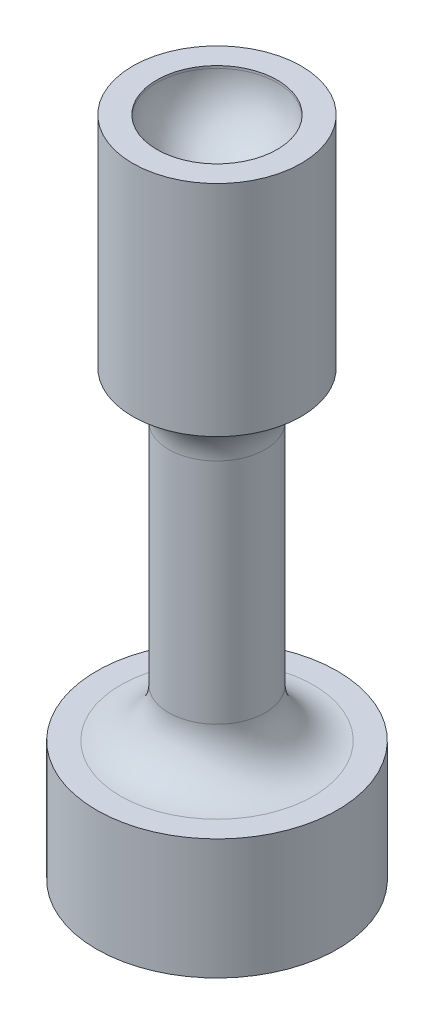
ISO-10303-21;
HEADER;
FILE_DESCRIPTION(('STEP AP214'),'2;1');
FILE_NAME('part.step','',(''),(''),'','','');
FILE_SCHEMA(('AUTOMOTIVE_DESIGN { 1 0 10303 214 1 1 1 1 }'));
ENDSEC;
DATA;
#1=APPLICATION_CONTEXT('core data for automotive mechanical design processes');
#2=APPLICATION_PROTOCOL_DEFINITION('international standard','automotive_design',2000,#1);
#3=PRODUCT_CONTEXT('',#1,'mechanical');
#4=PRODUCT('Part','Part','',(#3));
#5=PRODUCT_RELATED_PRODUCT_CATEGORY('part','',(#4));
#6=PRODUCT_DEFINITION_FORMATION('','',#4);
#7=PRODUCT_DEFINITION_CONTEXT('part definition',#1,'design');
#8=PRODUCT_DEFINITION('design','',#6,#7);
#9=PRODUCT_DEFINITION_SHAPE('','',#8);
#10=(LENGTH_UNIT() NAMED_UNIT(*) SI_UNIT(.MILLI.,.METRE.));
#11=(NAMED_UNIT(*) PLANE_ANGLE_UNIT() SI_UNIT($,.RADIAN.));
#12=(NAMED_UNIT(*) SI_UNIT($,.STERADIAN.) SOLID_ANGLE_UNIT());
#13=UNCERTAINTY_MEASURE_WITH_UNIT(LENGTH_MEASURE(1.E-05),#10,'distance_accuracy_value','');
#14=(GEOMETRIC_REPRESENTATION_CONTEXT(3) GLOBAL_UNCERTAINTY_ASSIGNED_CONTEXT((#13)) GLOBAL_UNIT_ASSIGNED_CONTEXT((#10,
#11,#12)) REPRESENTATION_CONTEXT('',''));
#15=CARTESIAN_POINT('',(0.,0.,0.));
#16=DIRECTION('',(0.,0.,1.));
#17=DIRECTION('',(1.,0.,0.));
#18=AXIS2_PLACEMENT_3D('',#15,#16,#17);
#19=CARTESIAN_POINT('',(0.,5.,0.));
#20=DIRECTION('',(0.,1.,0.));
#21=DIRECTION('',(0.,0.,1.));
#22=AXIS2_PLACEMENT_3D('',#19,#20,#21);
#23=PLANE('',#22);
#24=CARTESIAN_POINT('',(0.,5.,0.));
#25=DIRECTION('',(0.,1.,0.));
#26=DIRECTION('',(0.,0.,1.));
#27=AXIS2_PLACEMENT_3D('',#24,#25,#26);
#28=CIRCLE('',#27,4.);
#29=CARTESIAN_POINT('',(0.,5.,4.));
#30=VERTEX_POINT('',#29);
#31=EDGE_CURVE('E158',#30,#30,#28,.F.);
#32=ORIENTED_EDGE('',*,*,#31,.T.);
#33=EDGE_LOOP('',(#32));
#34=FACE_BOUND('',#33,.T.);
#35=CARTESIAN_POINT('',(0.,5.,0.));
#36=DIRECTION('',(0.,1.,0.));
#37=DIRECTION('',(0.,0.,1.));
#38=AXIS2_PLACEMENT_3D('',#35,#36,#37);
#39=CIRCLE('',#38,5.);
#40=CARTESIAN_POINT('',(0.,5.,5.));
#41=VERTEX_POINT('',#40);
#42=EDGE_CURVE('E148',#41,#41,#39,.T.);
#43=ORIENTED_EDGE('',*,*,#42,.T.);
#44=EDGE_LOOP('',(#43));
#45=FACE_BOUND('',#44,.T.);
#46=ADVANCED_FACE('F37',(#34,#45),#23,.T.);
#47=CARTESIAN_POINT('',(0.,0.,0.));
#48=DIRECTION('',(0.,1.,0.));
#49=DIRECTION('',(0.,0.,1.));
#50=AXIS2_PLACEMENT_3D('',#47,#48,#49);
#51=PLANE('',#50);
#52=DIRECTION('',(-0.491655792264215,0.,-0.870789631273276));
#53=VECTOR('',#52,1.);
#54=CARTESIAN_POINT('',(-2.05426209541312,0.,3.48042247100582));
#55=LINE('',#54,#53);
#56=CARTESIAN_POINT('',(-2.05426209541312,0.,3.48042247100582));
#57=VERTEX_POINT('',#56);
#58=CARTESIAN_POINT('',(-4.04126532349981,0.,-0.0388319251563097));
#59=VERTEX_POINT('',#58);
#60=EDGE_CURVE('E126',#57,#59,#55,.T.);
#61=ORIENTED_EDGE('',*,*,#60,.F.);
#62=DIRECTION('',(-0.999953838166848,0.,-0.00960840961806301));
#63=VECTOR('',#62,1.);
#64=CARTESIAN_POINT('',(1.98700322808668,0.,3.51925439616213));
#65=LINE('',#64,#63);
#66=CARTESIAN_POINT('',(1.98700322808668,0.,3.51925439616213));
#67=VERTEX_POINT('',#66);
#68=EDGE_CURVE('E52',#67,#57,#65,.T.);
#69=ORIENTED_EDGE('',*,*,#68,.F.);
#70=DIRECTION('',(-0.508298045902633,0.,0.861181221655212));
#71=VECTOR('',#70,1.);
#72=CARTESIAN_POINT('',(4.04126532349981,0.,0.0388319251563125));
#73=LINE('',#72,#71);
#74=CARTESIAN_POINT('',(4.04126532349981,0.,0.0388319251563125));
#75=VERTEX_POINT('',#74);
#76=EDGE_CURVE('E136',#75,#67,#73,.T.);
#77=ORIENTED_EDGE('',*,*,#76,.F.);
#78=DIRECTION('',(0.491655792264215,0.,0.870789631273276));
#79=VECTOR('',#78,1.);
#80=CARTESIAN_POINT('',(2.05426209541312,0.,-3.48042247100581));
#81=LINE('',#80,#79);
#82=CARTESIAN_POINT('',(2.05426209541312,0.,-3.48042247100581));
#83=VERTEX_POINT('',#82);
#84=EDGE_CURVE('E134',#83,#75,#81,.T.);
#85=ORIENTED_EDGE('',*,*,#84,.F.);
#86=DIRECTION('',(0.999953838166848,0.,0.00960840961806322));
#87=VECTOR('',#86,1.);
#88=CARTESIAN_POINT('',(-1.98700322808668,0.,-3.51925439616212));
#89=LINE('',#88,#87);
#90=CARTESIAN_POINT('',(-1.98700322808668,0.,-3.51925439616212));
#91=VERTEX_POINT('',#90);
#92=EDGE_CURVE('E100',#91,#83,#89,.T.);
#93=ORIENTED_EDGE('',*,*,#92,.F.);
#94=DIRECTION('',(0.508298045902633,0.,-0.861181221655212));
#95=VECTOR('',#94,1.);
#96=CARTESIAN_POINT('',(-4.04126532349981,0.,-0.0388319251563097));
#97=LINE('',#96,#95);
#98=EDGE_CURVE('E130',#59,#91,#97,.T.);
#99=ORIENTED_EDGE('',*,*,#98,.F.);
#100=EDGE_LOOP('',(#61,#69,#77,#85,#93,#99));
#101=FACE_BOUND('',#100,.T.);
#102=CARTESIAN_POINT('',(0.,0.,0.));
#103=DIRECTION('',(0.,1.,0.));
#104=DIRECTION('',(0.,0.,1.));
#105=AXIS2_PLACEMENT_3D('',#102,#103,#104);
#106=CIRCLE('',#105,5.);
#107=CARTESIAN_POINT('',(0.,0.,5.));
#108=VERTEX_POINT('',#107);
#109=EDGE_CURVE('E155',#108,#108,#106,.T.);
#110=ORIENTED_EDGE('',*,*,#109,.F.);
#111=EDGE_LOOP('',(#110));
#112=FACE_BOUND('',#111,.T.);
#113=ADVANCED_FACE('F177',(#101,#112),#51,.F.);
#114=CARTESIAN_POINT('',(0.,27.5,0.));
#115=DIRECTION('',(0.,-1.,0.));
#116=DIRECTION('',(0.,0.,-1.));
#117=AXIS2_PLACEMENT_3D('',#114,#115,#116);
#118=CYLINDRICAL_SURFACE('',#117,5.);
#119=ORIENTED_EDGE('',*,*,#109,.T.);
#120=EDGE_LOOP('',(#119));
#121=FACE_BOUND('',#120,.T.);
#122=ORIENTED_EDGE('',*,*,#42,.F.);
#123=EDGE_LOOP('',(#122));
#124=FACE_BOUND('',#123,.T.);
#125=ADVANCED_FACE('F181',(#121,#124),#118,.T.);
#126=CARTESIAN_POINT('',(1.98700322808668,3.,3.51925439616213));
#127=DIRECTION('',(-0.00960840961806301,0.,0.999953838166848));
#128=DIRECTION('',(0.999953838166848,0.,0.00960840961806301));
#129=AXIS2_PLACEMENT_3D('',#126,#127,#128);
#130=PLANE('',#129);
#131=ORIENTED_EDGE('',*,*,#68,.T.);
#132=DIRECTION('',(0.,-1.,0.));
#133=VECTOR('',#132,1.);
#134=CARTESIAN_POINT('',(-2.05426209541312,3.,3.48042247100582));
#135=LINE('',#134,#133);
#136=CARTESIAN_POINT('',(-2.05426209541312,3.,3.48042247100582));
#137=VERTEX_POINT('',#136);
#138=EDGE_CURVE('E82',#137,#57,#135,.T.);
#139=ORIENTED_EDGE('',*,*,#138,.F.);
#140=DIRECTION('',(-0.999953838166848,0.,-0.00960840961806301));
#141=VECTOR('',#140,1.);
#142=CARTESIAN_POINT('',(1.98700322808668,3.,3.51925439616213));
#143=LINE('',#142,#141);
#144=CARTESIAN_POINT('',(1.98700322808668,3.,3.51925439616213));
#145=VERTEX_POINT('',#144);
#146=EDGE_CURVE('E138',#145,#137,#143,.T.);
#147=ORIENTED_EDGE('',*,*,#146,.F.);
#148=DIRECTION('',(0.,-1.,0.));
#149=VECTOR('',#148,1.);
#150=CARTESIAN_POINT('',(1.98700322808668,3.,3.51925439616213));
#151=LINE('',#150,#149);
#152=EDGE_CURVE('E60',#145,#67,#151,.T.);
#153=ORIENTED_EDGE('',*,*,#152,.T.);
#154=EDGE_LOOP('',(#131,#139,#147,#153));
#155=FACE_BOUND('',#154,.T.);
#156=ADVANCED_FACE('F183',(#155),#130,.F.);
#157=CARTESIAN_POINT('',(4.04126532349981,3.,0.0388319251563125));
#158=DIRECTION('',(0.861181221655213,0.,0.508298045902633));
#159=DIRECTION('',(0.508298045902633,0.,-0.861181221655213));
#160=AXIS2_PLACEMENT_3D('',#157,#158,#159);
#161=PLANE('',#160);
#162=ORIENTED_EDGE('',*,*,#76,.T.);
#163=ORIENTED_EDGE('',*,*,#152,.F.);
#164=DIRECTION('',(-0.508298045902633,0.,0.861181221655212));
#165=VECTOR('',#164,1.);
#166=CARTESIAN_POINT('',(4.04126532349981,3.,0.0388319251563125));
#167=LINE('',#166,#165);
#168=CARTESIAN_POINT('',(4.04126532349981,3.,0.0388319251563125));
#169=VERTEX_POINT('',#168);
#170=EDGE_CURVE('E112',#169,#145,#167,.T.);
#171=ORIENTED_EDGE('',*,*,#170,.F.);
#172=DIRECTION('',(0.,-1.,0.));
#173=VECTOR('',#172,1.);
#174=CARTESIAN_POINT('',(4.04126532349981,3.,0.0388319251563125));
#175=LINE('',#174,#173);
#176=EDGE_CURVE('E104',#169,#75,#175,.T.);
#177=ORIENTED_EDGE('',*,*,#176,.T.);
#178=EDGE_LOOP('',(#162,#163,#171,#177));
#179=FACE_BOUND('',#178,.T.);
#180=ADVANCED_FACE('F190',(#179),#161,.F.);
#181=CARTESIAN_POINT('',(2.05426209541312,3.,-3.48042247100581));
#182=DIRECTION('',(0.870789631273276,0.,-0.491655792264215));
#183=DIRECTION('',(-0.491655792264215,0.,-0.870789631273276));
#184=AXIS2_PLACEMENT_3D('',#181,#182,#183);
#185=PLANE('',#184);
#186=ORIENTED_EDGE('',*,*,#84,.T.);
#187=ORIENTED_EDGE('',*,*,#176,.F.);
#188=DIRECTION('',(0.491655792264215,0.,0.870789631273276));
#189=VECTOR('',#188,1.);
#190=CARTESIAN_POINT('',(2.05426209541312,3.,-3.48042247100581));
#191=LINE('',#190,#189);
#192=CARTESIAN_POINT('',(2.05426209541312,3.,-3.48042247100581));
#193=VERTEX_POINT('',#192);
#194=EDGE_CURVE('E108',#193,#169,#191,.T.);
#195=ORIENTED_EDGE('',*,*,#194,.F.);
#196=DIRECTION('',(0.,-1.,0.));
#197=VECTOR('',#196,1.);
#198=CARTESIAN_POINT('',(2.05426209541312,3.,-3.48042247100581));
#199=LINE('',#198,#197);
#200=EDGE_CURVE('E93',#193,#83,#199,.T.);
#201=ORIENTED_EDGE('',*,*,#200,.T.);
#202=EDGE_LOOP('',(#186,#187,#195,#201));
#203=FACE_BOUND('',#202,.T.);
#204=ADVANCED_FACE('F109',(#203),#185,.F.);
#205=CARTESIAN_POINT('',(-1.98700322808668,3.,-3.51925439616212));
#206=DIRECTION('',(0.00960840961806322,0.,-0.999953838166848));
#207=DIRECTION('',(-0.999953838166848,0.,-0.00960840961806322));
#208=AXIS2_PLACEMENT_3D('',#205,#206,#207);
#209=PLANE('',#208);
#210=ORIENTED_EDGE('',*,*,#92,.T.);
#211=ORIENTED_EDGE('',*,*,#200,.F.);
#212=DIRECTION('',(0.999953838166848,0.,0.00960840961806322));
#213=VECTOR('',#212,1.);
#214=CARTESIAN_POINT('',(-1.98700322808668,3.,-3.51925439616212));
#215=LINE('',#214,#213);
#216=CARTESIAN_POINT('',(-1.98700322808668,3.,-3.51925439616212));
#217=VERTEX_POINT('',#216);
#218=EDGE_CURVE('E97',#217,#193,#215,.T.);
#219=ORIENTED_EDGE('',*,*,#218,.F.);
#220=DIRECTION('',(0.,-1.,0.));
#221=VECTOR('',#220,1.);
#222=CARTESIAN_POINT('',(-1.98700322808668,3.,-3.51925439616212));
#223=LINE('',#222,#221);
#224=EDGE_CURVE('E105',#217,#91,#223,.T.);
#225=ORIENTED_EDGE('',*,*,#224,.T.);
#226=EDGE_LOOP('',(#210,#211,#219,#225));
#227=FACE_BOUND('',#226,.T.);
#228=ADVANCED_FACE('F95',(#227),#209,.F.);
#229=CARTESIAN_POINT('',(-4.04126532349981,3.,-0.0388319251563097));
#230=DIRECTION('',(-0.861181221655213,0.,-0.508298045902633));
#231=DIRECTION('',(-0.508298045902633,0.,0.861181221655213));
#232=AXIS2_PLACEMENT_3D('',#229,#230,#231);
#233=PLANE('',#232);
#234=ORIENTED_EDGE('',*,*,#98,.T.);
#235=ORIENTED_EDGE('',*,*,#224,.F.);
#236=DIRECTION('',(0.508298045902633,0.,-0.861181221655212));
#237=VECTOR('',#236,1.);
#238=CARTESIAN_POINT('',(-4.04126532349981,3.,-0.0388319251563097));
#239=LINE('',#238,#237);
#240=CARTESIAN_POINT('',(-4.04126532349981,3.,-0.0388319251563097));
#241=VERTEX_POINT('',#240);
#242=EDGE_CURVE('E118',#241,#217,#239,.T.);
#243=ORIENTED_EDGE('',*,*,#242,.F.);
#244=DIRECTION('',(0.,-1.,0.));
#245=VECTOR('',#244,1.);
#246=CARTESIAN_POINT('',(-4.04126532349981,3.,-0.0388319251563097));
#247=LINE('',#246,#245);
#248=EDGE_CURVE('E143',#241,#59,#247,.T.);
#249=ORIENTED_EDGE('',*,*,#248,.T.);
#250=EDGE_LOOP('',(#234,#235,#243,#249));
#251=FACE_BOUND('',#250,.T.);
#252=ADVANCED_FACE('F230',(#251),#233,.F.);
#253=CARTESIAN_POINT('',(-2.05426209541312,3.,3.48042247100582));
#254=DIRECTION('',(-0.870789631273275,0.,0.491655792264215));
#255=DIRECTION('',(0.491655792264215,0.,0.870789631273276));
#256=AXIS2_PLACEMENT_3D('',#253,#254,#255);
#257=PLANE('',#256);
#258=ORIENTED_EDGE('',*,*,#60,.T.);
#259=ORIENTED_EDGE('',*,*,#248,.F.);
#260=DIRECTION('',(-0.491655792264215,0.,-0.870789631273276));
#261=VECTOR('',#260,1.);
#262=CARTESIAN_POINT('',(-2.05426209541312,3.,3.48042247100582));
#263=LINE('',#262,#261);
#264=EDGE_CURVE('E120',#137,#241,#263,.T.);
#265=ORIENTED_EDGE('',*,*,#264,.F.);
#266=ORIENTED_EDGE('',*,*,#138,.T.);
#267=EDGE_LOOP('',(#258,#259,#265,#266));
#268=FACE_BOUND('',#267,.T.);
#269=ADVANCED_FACE('F227',(#268),#257,.F.);
#270=CARTESIAN_POINT('',(0.,3.,0.));
#271=DIRECTION('',(0.,-1.,0.));
#272=DIRECTION('',(0.,0.,-1.));
#273=AXIS2_PLACEMENT_3D('',#270,#271,#272);
#274=PLANE('',#273);
#275=ORIENTED_EDGE('',*,*,#146,.T.);
#276=ORIENTED_EDGE('',*,*,#264,.T.);
#277=ORIENTED_EDGE('',*,*,#242,.T.);
#278=ORIENTED_EDGE('',*,*,#218,.T.);
#279=ORIENTED_EDGE('',*,*,#194,.T.);
#280=ORIENTED_EDGE('',*,*,#170,.T.);
#281=EDGE_LOOP('',(#275,#276,#277,#278,#279,#280));
#282=FACE_BOUND('',#281,.T.);
#283=ADVANCED_FACE('F115',(#282),#274,.T.);
#284=CARTESIAN_POINT('',(0.,0.,0.));
#285=DIRECTION('',(0.,-1.,0.));
#286=DIRECTION('',(0.,0.,-1.));
#287=AXIS2_PLACEMENT_3D('',#284,#285,#286);
#288=CYLINDRICAL_SURFACE('',#287,2.);
#289=CARTESIAN_POINT('',(0.,16.4635083268963,0.));
#290=DIRECTION('',(0.,1.,0.));
#291=DIRECTION('',(0.,0.,1.));
#292=AXIS2_PLACEMENT_3D('',#289,#290,#291);
#293=CIRCLE('',#292,2.);
#294=CARTESIAN_POINT('',(0.,16.4635083268963,2.));
#295=VERTEX_POINT('',#294);
#296=EDGE_CURVE('E11',#295,#295,#293,.F.);
#297=ORIENTED_EDGE('',*,*,#296,.T.);
#298=EDGE_LOOP('',(#297));
#299=FACE_BOUND('',#298,.T.);
#300=CARTESIAN_POINT('',(0.,7.,0.));
#301=DIRECTION('',(0.,1.,0.));
#302=DIRECTION('',(0.,0.,1.));
#303=AXIS2_PLACEMENT_3D('',#300,#301,#302);
#304=CIRCLE('',#303,2.);
#305=CARTESIAN_POINT('',(0.,7.,2.));
#306=VERTEX_POINT('',#305);
#307=EDGE_CURVE('E45',#306,#306,#304,.T.);
#308=ORIENTED_EDGE('',*,*,#307,.T.);
#309=EDGE_LOOP('',(#308));
#310=FACE_BOUND('',#309,.T.);
#311=ADVANCED_FACE('F167',(#299,#310),#288,.T.);
#312=CARTESIAN_POINT('',(0.,27.4,0.));
#313=DIRECTION('',(0.,0.,1.));
#314=DIRECTION('',(1.,0.,0.));
#315=AXIS2_PLACEMENT_3D('',#312,#313,#314);
#316=SPHERICAL_SURFACE('',#315,2.5);
#317=CARTESIAN_POINT('',(0.,27.4,0.));
#318=DIRECTION('',(0.,1.,0.));
#319=DIRECTION('',(0.,0.,1.));
#320=AXIS2_PLACEMENT_3D('',#317,#318,#319);
#321=SPHERICAL_SURFACE('',#320,2.5);
#322=CARTESIAN_POINT('',(0.,27.4,0.));
#323=DIRECTION('',(0.,1.,0.));
#324=DIRECTION('',(0.,0.,1.));
#325=AXIS2_PLACEMENT_3D('',#322,#323,#324);
#326=CIRCLE('',#325,2.5);
#327=CARTESIAN_POINT('',(0.,27.4,2.5));
#328=VERTEX_POINT('',#327);
#329=EDGE_CURVE('E154',#328,#328,#326,.T.);
#330=ORIENTED_EDGE('',*,*,#329,.T.);
#331=EDGE_LOOP('',(#330));
#332=FACE_BOUND('',#331,.T.);
#333=ADVANCED_FACE('F197',(#332),#321,.F.);
#334=CARTESIAN_POINT('',(0.,27.4,0.));
#335=DIRECTION('',(0.,1.,0.));
#336=DIRECTION('',(0.,0.,1.));
#337=AXIS2_PLACEMENT_3D('',#334,#335,#336);
#338=CYLINDRICAL_SURFACE('',#337,2.5);
#339=ORIENTED_EDGE('',*,*,#329,.F.);
#340=EDGE_LOOP('',(#339));
#341=FACE_BOUND('',#340,.T.);
#342=CARTESIAN_POINT('',(0.,27.5,0.));
#343=DIRECTION('',(0.,1.,0.));
#344=DIRECTION('',(0.,0.,1.));
#345=AXIS2_PLACEMENT_3D('',#342,#343,#344);
#346=CIRCLE('',#345,2.5);
#347=CARTESIAN_POINT('',(0.,27.5,2.5));
#348=VERTEX_POINT('',#347);
#349=EDGE_CURVE('E151',#348,#348,#346,.T.);
#350=ORIENTED_EDGE('',*,*,#349,.T.);
#351=EDGE_LOOP('',(#350));
#352=FACE_BOUND('',#351,.T.);
#353=ADVANCED_FACE('F199',(#341,#352),#338,.F.);
#354=CARTESIAN_POINT('',(0.,27.5,0.));
#355=DIRECTION('',(0.,1.,0.));
#356=DIRECTION('',(0.,0.,1.));
#357=AXIS2_PLACEMENT_3D('',#354,#355,#356);
#358=PLANE('',#357);
#359=ORIENTED_EDGE('',*,*,#349,.F.);
#360=EDGE_LOOP('',(#359));
#361=FACE_BOUND('',#360,.T.);
#362=CARTESIAN_POINT('',(0.,27.5,0.));
#363=DIRECTION('',(0.,1.,0.));
#364=DIRECTION('',(0.,0.,1.));
#365=AXIS2_PLACEMENT_3D('',#362,#363,#364);
#366=CIRCLE('',#365,3.5);
#367=CARTESIAN_POINT('',(0.,27.5,3.5));
#368=VERTEX_POINT('',#367);
#369=EDGE_CURVE('E140',#368,#368,#366,.T.);
#370=ORIENTED_EDGE('',*,*,#369,.T.);
#371=EDGE_LOOP('',(#370));
#372=FACE_BOUND('',#371,.T.);
#373=ADVANCED_FACE('F205',(#361,#372),#358,.T.);
#374=CARTESIAN_POINT('',(0.,5.,0.));
#375=DIRECTION('',(0.,1.,0.));
#376=DIRECTION('',(0.,0.,1.));
#377=AXIS2_PLACEMENT_3D('',#374,#375,#376);
#378=CYLINDRICAL_SURFACE('',#377,3.5);
#379=CARTESIAN_POINT('',(0.,18.4,0.));
#380=DIRECTION('',(0.,1.,0.));
#381=DIRECTION('',(0.,0.,1.));
#382=AXIS2_PLACEMENT_3D('',#379,#380,#381);
#383=CIRCLE('',#382,3.5);
#384=CARTESIAN_POINT('',(0.,18.4,3.5));
#385=VERTEX_POINT('',#384);
#386=EDGE_CURVE('E127',#385,#385,#383,.F.);
#387=CARTESIAN_POINT('',(0.,18.4,3.5));
#388=CARTESIAN_POINT('',(0.,18.4947916666667,3.5));
#389=CARTESIAN_POINT('',(0.,18.5895833333333,3.5));
#390=CARTESIAN_POINT('',(0.,18.7791666666667,3.5));
#391=CARTESIAN_POINT('',(0.,18.8739583333333,3.5));
#392=CARTESIAN_POINT('',(0.,19.0635416666667,3.5));
#393=CARTESIAN_POINT('',(0.,19.1583333333333,3.5));
#394=CARTESIAN_POINT('',(0.,19.3479166666667,3.5));
#395=CARTESIAN_POINT('',(0.,19.4427083333333,3.5));
#396=CARTESIAN_POINT('',(0.,19.6322916666667,3.5));
#397=CARTESIAN_POINT('',(0.,19.7270833333333,3.5));
#398=CARTESIAN_POINT('',(0.,19.9166666666667,3.5));
#399=CARTESIAN_POINT('',(0.,20.0114583333333,3.5));
#400=CARTESIAN_POINT('',(0.,20.2010416666667,3.5));
#401=CARTESIAN_POINT('',(0.,20.2958333333333,3.5));
#402=CARTESIAN_POINT('',(0.,20.4854166666667,3.5));
#403=CARTESIAN_POINT('',(0.,20.5802083333333,3.5));
#404=CARTESIAN_POINT('',(0.,20.7697916666667,3.5));
#405=CARTESIAN_POINT('',(0.,20.8645833333333,3.5));
#406=CARTESIAN_POINT('',(0.,21.0541666666667,3.5));
#407=CARTESIAN_POINT('',(0.,21.1489583333333,3.5));
#408=CARTESIAN_POINT('',(0.,21.3385416666667,3.5));
#409=CARTESIAN_POINT('',(0.,21.4333333333333,3.5));
#410=CARTESIAN_POINT('',(0.,21.6229166666667,3.5));
#411=CARTESIAN_POINT('',(0.,21.7177083333333,3.5));
#412=CARTESIAN_POINT('',(0.,21.9072916666667,3.5));
#413=CARTESIAN_POINT('',(0.,22.0020833333333,3.5));
#414=CARTESIAN_POINT('',(0.,22.1916666666667,3.5));
#415=CARTESIAN_POINT('',(0.,22.2864583333333,3.5));
#416=CARTESIAN_POINT('',(0.,22.4760416666667,3.5));
#417=CARTESIAN_POINT('',(0.,22.5708333333333,3.5));
#418=CARTESIAN_POINT('',(0.,22.7604166666667,3.5));
#419=CARTESIAN_POINT('',(0.,22.8552083333333,3.5));
#420=CARTESIAN_POINT('',(0.,23.0447916666667,3.5));
#421=CARTESIAN_POINT('',(0.,23.1395833333333,3.5));
#422=CARTESIAN_POINT('',(0.,23.3291666666667,3.5));
#423=CARTESIAN_POINT('',(0.,23.4239583333333,3.5));
#424=CARTESIAN_POINT('',(0.,23.6135416666667,3.5));
#425=CARTESIAN_POINT('',(0.,23.7083333333333,3.5));
#426=CARTESIAN_POINT('',(0.,23.8979166666667,3.5));
#427=CARTESIAN_POINT('',(0.,23.9927083333333,3.5));
#428=CARTESIAN_POINT('',(0.,24.1822916666667,3.5));
#429=CARTESIAN_POINT('',(0.,24.2770833333333,3.5));
#430=CARTESIAN_POINT('',(0.,24.4666666666667,3.5));
#431=CARTESIAN_POINT('',(0.,24.5614583333333,3.5));
#432=CARTESIAN_POINT('',(0.,24.7510416666667,3.5));
#433=CARTESIAN_POINT('',(0.,24.8458333333333,3.5));
#434=CARTESIAN_POINT('',(0.,25.0354166666667,3.5));
#435=CARTESIAN_POINT('',(0.,25.1302083333333,3.5));
#436=CARTESIAN_POINT('',(0.,25.3197916666667,3.5));
#437=CARTESIAN_POINT('',(0.,25.4145833333333,3.5));
#438=CARTESIAN_POINT('',(0.,25.6041666666667,3.5));
#439=CARTESIAN_POINT('',(0.,25.6989583333333,3.5));
#440=CARTESIAN_POINT('',(0.,25.8885416666667,3.5));
#441=CARTESIAN_POINT('',(0.,25.9833333333333,3.5));
#442=CARTESIAN_POINT('',(0.,26.1729166666667,3.5));
#443=CARTESIAN_POINT('',(0.,26.2677083333333,3.5));
#444=CARTESIAN_POINT('',(0.,26.4572916666667,3.5));
#445=CARTESIAN_POINT('',(0.,26.5520833333333,3.5));
#446=CARTESIAN_POINT('',(0.,26.7416666666667,3.5));
#447=CARTESIAN_POINT('',(0.,26.8364583333333,3.5));
#448=CARTESIAN_POINT('',(0.,27.0260416666667,3.5));
#449=CARTESIAN_POINT('',(0.,27.1208333333333,3.5));
#450=CARTESIAN_POINT('',(0.,27.3104166666667,3.5));
#451=CARTESIAN_POINT('',(0.,27.4052083333333,3.5));
#452=CARTESIAN_POINT('',(0.,27.5,3.5));
#453=B_SPLINE_CURVE_WITH_KNOTS('',3,(#387,#388,#389,#390,#391,#392,#393,#394,#395,#396,#397,
#398,#399,#400,#401,#402,#403,#404,#405,#406,#407,#408,#409,#410,#411,#412,#413,#414,#415,#416,
#417,#418,#419,#420,#421,#422,#423,#424,#425,#426,#427,#428,#429,#430,#431,#432,#433,#434,#435,
#436,#437,#438,#439,#440,#441,#442,#443,#444,#445,#446,#447,#448,#449,#450,#451,#452),
.UNSPECIFIED.,.F.,.F.,(4,2,2,2,2,2,2,2,2,2,2,2,2,2,2,2,2,2,2,2,2,2,2,2,2,2,2,2,2,2,2,2,4),(0.,
0.284374999999996,0.56875,0.853124999999996,1.1375,1.421875,1.70625,1.990625,2.275,2.559375,
2.84375,3.128125,3.4125,3.696875,3.98125,4.26562499999999,4.55,4.834375,5.11875,
5.40312499999999,5.6875,5.971875,6.25625,6.540625,6.825,7.109375,7.39375,7.678125,7.9625,
8.246875,8.53125,8.815625,9.1),.UNSPECIFIED.);
#454=EDGE_CURVE('BSEAM172',#385,#368,#453,.T.);
#455=ORIENTED_EDGE('',*,*,#386,.F.);
#456=ORIENTED_EDGE('',*,*,#369,.F.);
#457=ORIENTED_EDGE('',*,*,#454,.T.);
#458=ORIENTED_EDGE('',*,*,#454,.F.);
#459=EDGE_LOOP('',(#455,#457,#456,#458));
#460=FACE_BOUND('',#459,.T.);
#461=ADVANCED_FACE('F172',(#460),#378,.T.);
#462=CARTESIAN_POINT('',(0.,7.,0.));
#463=DIRECTION('',(0.,1.,0.));
#464=DIRECTION('',(0.,0.,1.));
#465=AXIS2_PLACEMENT_3D('',#462,#463,#464);
#466=TOROIDAL_SURFACE('',#465,4.,2.);
#467=ORIENTED_EDGE('',*,*,#307,.F.);
#468=EDGE_LOOP('',(#467));
#469=FACE_BOUND('',#468,.T.);
#470=ORIENTED_EDGE('',*,*,#31,.F.);
#471=EDGE_LOOP('',(#470));
#472=FACE_BOUND('',#471,.T.);
#473=ADVANCED_FACE('F169',(#469,#472),#466,.F.);
#474=CARTESIAN_POINT('',(0.,16.4635083268963,0.));
#475=DIRECTION('',(0.,1.,0.));
#476=DIRECTION('',(0.,0.,1.));
#477=AXIS2_PLACEMENT_3D('',#474,#475,#476);
#478=TOROIDAL_SURFACE('',#477,4.,2.);
#479=ORIENTED_EDGE('',*,*,#386,.T.);
#480=EDGE_LOOP('',(#479));
#481=FACE_BOUND('',#480,.T.);
#482=ORIENTED_EDGE('',*,*,#296,.F.);
#483=EDGE_LOOP('',(#482));
#484=FACE_BOUND('',#483,.T.);
#485=ADVANCED_FACE('F39',(#481,#484),#478,.F.);
#486=CLOSED_SHELL('',(#46,#113,#125,#156,#180,#204,#228,#252,#269,#283,#311,#333,#353,#373,#461,
#473,#485));
#487=MANIFOLD_SOLID_BREP('B2',#486);
#488=ADVANCED_BREP_SHAPE_REPRESENTATION('',(#18,#487),#14);
#489=SHAPE_DEFINITION_REPRESENTATION(#9,#488);
ENDSEC;
END-ISO-10303-21;
